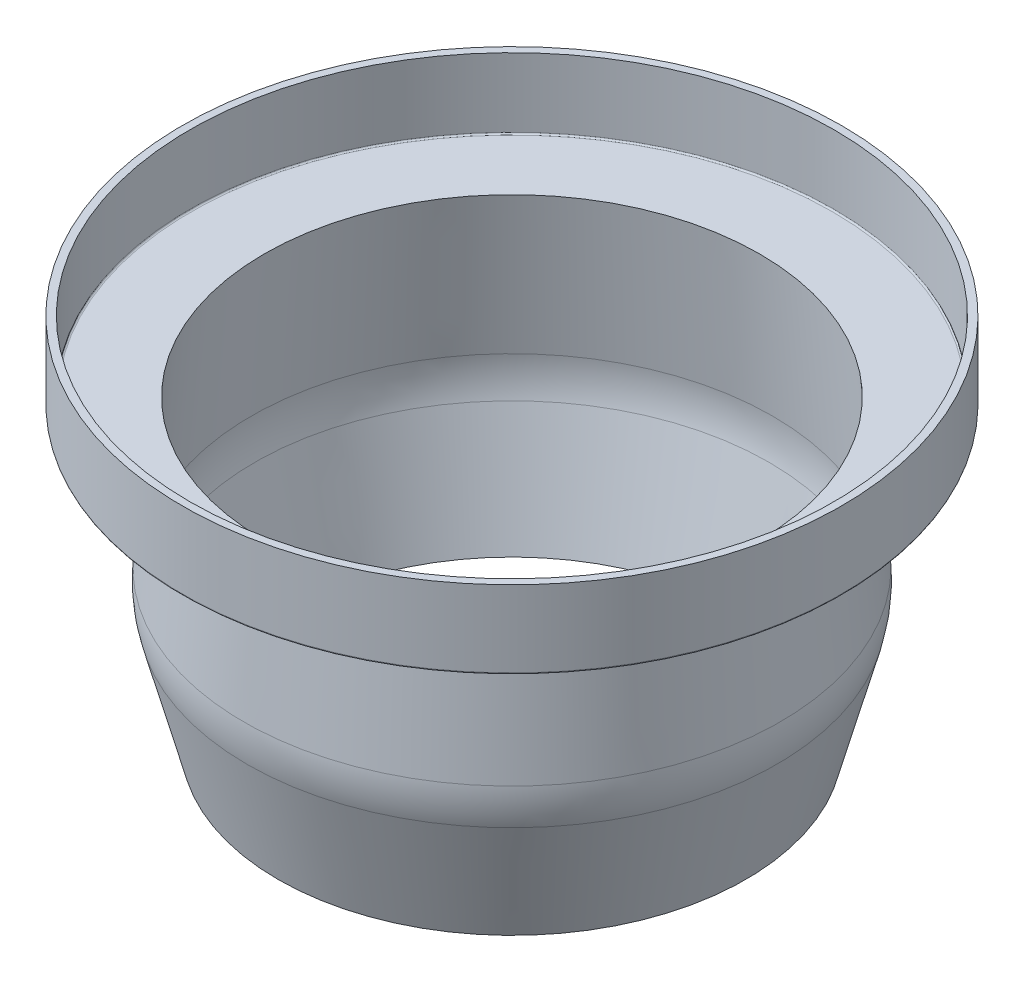
ISO-10303-21;
HEADER;
FILE_DESCRIPTION(('STEP AP214'),'2;1');
FILE_NAME('part.step','',(''),(''),'','','');
FILE_SCHEMA(('AUTOMOTIVE_DESIGN { 1 0 10303 214 1 1 1 1 }'));
ENDSEC;
DATA;
#1=APPLICATION_CONTEXT('core data for automotive mechanical design processes');
#2=APPLICATION_PROTOCOL_DEFINITION('international standard','automotive_design',2000,#1);
#3=PRODUCT_CONTEXT('',#1,'mechanical');
#4=PRODUCT('Part','Part','',(#3));
#5=PRODUCT_RELATED_PRODUCT_CATEGORY('part','',(#4));
#6=PRODUCT_DEFINITION_FORMATION('','',#4);
#7=PRODUCT_DEFINITION_CONTEXT('part definition',#1,'design');
#8=PRODUCT_DEFINITION('design','',#6,#7);
#9=PRODUCT_DEFINITION_SHAPE('','',#8);
#10=(LENGTH_UNIT() NAMED_UNIT(*) SI_UNIT(.MILLI.,.METRE.));
#11=(NAMED_UNIT(*) PLANE_ANGLE_UNIT() SI_UNIT($,.RADIAN.));
#12=(NAMED_UNIT(*) SI_UNIT($,.STERADIAN.) SOLID_ANGLE_UNIT());
#13=UNCERTAINTY_MEASURE_WITH_UNIT(LENGTH_MEASURE(1.E-05),#10,'distance_accuracy_value','');
#14=(GEOMETRIC_REPRESENTATION_CONTEXT(3) GLOBAL_UNCERTAINTY_ASSIGNED_CONTEXT((#13)) GLOBAL_UNIT_ASSIGNED_CONTEXT((#10,
#11,#12)) REPRESENTATION_CONTEXT('',''));
#15=CARTESIAN_POINT('',(0.,0.,0.));
#16=DIRECTION('',(0.,0.,1.));
#17=DIRECTION('',(1.,0.,0.));
#18=AXIS2_PLACEMENT_3D('',#15,#16,#17);
#19=CARTESIAN_POINT('',(0.,0.260642927640769,0.));
#20=DIRECTION('',(0.,-1.,0.));
#21=DIRECTION('',(0.,0.,-1.));
#22=AXIS2_PLACEMENT_3D('',#19,#20,#21);
#23=TOROIDAL_SURFACE('',#22,20.2455301881118,15.);
#24=CARTESIAN_POINT('',(0.,-3.62164274889707,0.));
#25=DIRECTION('',(0.,-1.,0.));
#26=DIRECTION('',(0.,0.,-1.));
#27=AXIS2_PLACEMENT_3D('',#24,#25,#26);
#28=CIRCLE('',#27,34.7344175824478);
#29=CARTESIAN_POINT('',(0.,-3.62164274889707,-34.7344175824478));
#30=VERTEX_POINT('',#29);
#31=EDGE_CURVE('E96',#30,#30,#28,.T.);
#32=ORIENTED_EDGE('',*,*,#31,.T.);
#33=EDGE_LOOP('',(#32));
#34=FACE_BOUND('',#33,.T.);
#35=CARTESIAN_POINT('',(0.,1.56797906885575,0.));
#36=DIRECTION('',(0.,-1.,0.));
#37=DIRECTION('',(0.,0.,-1.));
#38=AXIS2_PLACEMENT_3D('',#35,#36,#37);
#39=CIRCLE('',#38,35.188450659488);
#40=CARTESIAN_POINT('',(0.,1.56797906885575,-35.188450659488));
#41=VERTEX_POINT('',#40);
#42=EDGE_CURVE('E10',#41,#41,#39,.T.);
#43=ORIENTED_EDGE('',*,*,#42,.F.);
#44=EDGE_LOOP('',(#43));
#45=FACE_BOUND('',#44,.T.);
#46=ADVANCED_FACE('F37',(#34,#45),#23,.F.);
#47=CARTESIAN_POINT('',(0.,21.3888888888889,0.));
#48=DIRECTION('',(0.,-1.,0.));
#49=DIRECTION('',(0.,0.,-1.));
#50=AXIS2_PLACEMENT_3D('',#47,#48,#49);
#51=CONICAL_SURFACE('',#50,33.4543457494654,0.0872664625997204);
#52=ORIENTED_EDGE('',*,*,#42,.T.);
#53=EDGE_LOOP('',(#52));
#54=FACE_BOUND('',#53,.T.);
#55=CARTESIAN_POINT('',(0.,21.3888888888889,0.));
#56=DIRECTION('',(0.,-1.,0.));
#57=DIRECTION('',(0.,0.,-1.));
#58=AXIS2_PLACEMENT_3D('',#55,#56,#57);
#59=CIRCLE('',#58,33.4543457494654);
#60=CARTESIAN_POINT('',(0.,21.3888888888889,-33.4543457494654));
#61=VERTEX_POINT('',#60);
#62=EDGE_CURVE('E44',#61,#61,#59,.T.);
#63=ORIENTED_EDGE('',*,*,#62,.F.);
#64=EDGE_LOOP('',(#63));
#65=FACE_BOUND('',#64,.T.);
#66=ADVANCED_FACE('F115',(#54,#65),#51,.F.);
#67=CARTESIAN_POINT('',(0.,21.3888888888889,0.));
#68=DIRECTION('',(0.,1.,0.));
#69=DIRECTION('',(0.,0.,1.));
#70=AXIS2_PLACEMENT_3D('',#67,#68,#69);
#71=PLANE('',#70);
#72=ORIENTED_EDGE('',*,*,#62,.T.);
#73=EDGE_LOOP('',(#72));
#74=FACE_BOUND('',#73,.T.);
#75=CARTESIAN_POINT('',(0.,21.3888888888889,0.));
#76=DIRECTION('',(0.,-1.,0.));
#77=DIRECTION('',(0.,0.,-1.));
#78=AXIS2_PLACEMENT_3D('',#75,#76,#77);
#79=CIRCLE('',#78,43.3);
#80=CARTESIAN_POINT('',(0.,21.3888888888889,-43.3));
#81=VERTEX_POINT('',#80);
#82=EDGE_CURVE('E49',#81,#81,#79,.T.);
#83=ORIENTED_EDGE('',*,*,#82,.F.);
#84=EDGE_LOOP('',(#83));
#85=FACE_BOUND('',#84,.T.);
#86=ADVANCED_FACE('F119',(#74,#85),#71,.T.);
#87=CARTESIAN_POINT('',(0.,21.5888888888889,0.));
#88=DIRECTION('',(0.,-1.,0.));
#89=DIRECTION('',(0.,0.,-1.));
#90=AXIS2_PLACEMENT_3D('',#87,#88,#89);
#91=TOROIDAL_SURFACE('',#90,43.3,0.199999999999999);
#92=ORIENTED_EDGE('',*,*,#82,.T.);
#93=EDGE_LOOP('',(#92));
#94=FACE_BOUND('',#93,.T.);
#95=CARTESIAN_POINT('',(0.,21.5888888888889,0.));
#96=DIRECTION('',(0.,-1.,0.));
#97=DIRECTION('',(0.,0.,-1.));
#98=AXIS2_PLACEMENT_3D('',#95,#96,#97);
#99=CIRCLE('',#98,43.5);
#100=CARTESIAN_POINT('',(0.,21.5888888888889,-43.5));
#101=VERTEX_POINT('',#100);
#102=EDGE_CURVE('E54',#101,#101,#99,.T.);
#103=ORIENTED_EDGE('',*,*,#102,.F.);
#104=EDGE_LOOP('',(#103));
#105=FACE_BOUND('',#104,.T.);
#106=ADVANCED_FACE('F123',(#94,#105),#91,.F.);
#107=CARTESIAN_POINT('',(0.,0.,0.));
#108=DIRECTION('',(0.,-1.,0.));
#109=DIRECTION('',(0.,0.,-1.));
#110=AXIS2_PLACEMENT_3D('',#107,#108,#109);
#111=CYLINDRICAL_SURFACE('',#110,43.5);
#112=ORIENTED_EDGE('',*,*,#102,.T.);
#113=EDGE_LOOP('',(#112));
#114=FACE_BOUND('',#113,.T.);
#115=CARTESIAN_POINT('',(0.,30.8888888888889,0.));
#116=DIRECTION('',(0.,-1.,0.));
#117=DIRECTION('',(0.,0.,-1.));
#118=AXIS2_PLACEMENT_3D('',#115,#116,#117);
#119=CIRCLE('',#118,43.5);
#120=CARTESIAN_POINT('',(0.,30.8888888888889,-43.5));
#121=VERTEX_POINT('',#120);
#122=EDGE_CURVE('E60',#121,#121,#119,.T.);
#123=ORIENTED_EDGE('',*,*,#122,.F.);
#124=EDGE_LOOP('',(#123));
#125=FACE_BOUND('',#124,.T.);
#126=ADVANCED_FACE('F129',(#114,#125),#111,.F.);
#127=CARTESIAN_POINT('',(0.,30.8888888888889,0.));
#128=DIRECTION('',(0.,1.,0.));
#129=DIRECTION('',(0.,0.,1.));
#130=AXIS2_PLACEMENT_3D('',#127,#128,#129);
#131=PLANE('',#130);
#132=ORIENTED_EDGE('',*,*,#122,.T.);
#133=EDGE_LOOP('',(#132));
#134=FACE_BOUND('',#133,.T.);
#135=CARTESIAN_POINT('',(0.,30.8888888888889,0.));
#136=DIRECTION('',(0.,-1.,0.));
#137=DIRECTION('',(0.,0.,-1.));
#138=AXIS2_PLACEMENT_3D('',#135,#136,#137);
#139=CIRCLE('',#138,44.5);
#140=CARTESIAN_POINT('',(0.,30.8888888888889,-44.5));
#141=VERTEX_POINT('',#140);
#142=EDGE_CURVE('E64',#141,#141,#139,.T.);
#143=ORIENTED_EDGE('',*,*,#142,.F.);
#144=EDGE_LOOP('',(#143));
#145=FACE_BOUND('',#144,.T.);
#146=ADVANCED_FACE('F133',(#134,#145),#131,.T.);
#147=CARTESIAN_POINT('',(0.,0.,0.));
#148=DIRECTION('',(0.,-1.,0.));
#149=DIRECTION('',(0.,0.,-1.));
#150=AXIS2_PLACEMENT_3D('',#147,#148,#149);
#151=CYLINDRICAL_SURFACE('',#150,44.5);
#152=CARTESIAN_POINT('',(0.,20.5888888888889,0.));
#153=DIRECTION('',(0.,-1.,0.));
#154=DIRECTION('',(0.,0.,-1.));
#155=AXIS2_PLACEMENT_3D('',#152,#153,#154);
#156=CIRCLE('',#155,44.5);
#157=CARTESIAN_POINT('',(0.,20.5888888888889,-44.5));
#158=VERTEX_POINT('',#157);
#159=EDGE_CURVE('E68',#158,#158,#156,.T.);
#160=ORIENTED_EDGE('',*,*,#159,.F.);
#161=EDGE_LOOP('',(#160));
#162=FACE_BOUND('',#161,.T.);
#163=ORIENTED_EDGE('',*,*,#142,.T.);
#164=EDGE_LOOP('',(#163));
#165=FACE_BOUND('',#164,.T.);
#166=ADVANCED_FACE('F137',(#162,#165),#151,.T.);
#167=CARTESIAN_POINT('',(0.,20.5888888888889,0.));
#168=DIRECTION('',(0.,-1.,0.));
#169=DIRECTION('',(0.,0.,-1.));
#170=AXIS2_PLACEMENT_3D('',#167,#168,#169);
#171=TOROIDAL_SURFACE('',#170,44.3,0.199999999999999);
#172=CARTESIAN_POINT('',(0.,20.3888888888889,0.));
#173=DIRECTION('',(0.,-1.,0.));
#174=DIRECTION('',(0.,0.,-1.));
#175=AXIS2_PLACEMENT_3D('',#172,#173,#174);
#176=CIRCLE('',#175,44.3);
#177=CARTESIAN_POINT('',(0.,20.3888888888889,-44.3));
#178=VERTEX_POINT('',#177);
#179=EDGE_CURVE('E72',#178,#178,#176,.T.);
#180=ORIENTED_EDGE('',*,*,#179,.F.);
#181=EDGE_LOOP('',(#180));
#182=FACE_BOUND('',#181,.T.);
#183=ORIENTED_EDGE('',*,*,#159,.T.);
#184=EDGE_LOOP('',(#183));
#185=FACE_BOUND('',#184,.T.);
#186=ADVANCED_FACE('F141',(#182,#185),#171,.T.);
#187=CARTESIAN_POINT('',(0.,20.3888888888889,0.));
#188=DIRECTION('',(0.,1.,0.));
#189=DIRECTION('',(0.,0.,1.));
#190=AXIS2_PLACEMENT_3D('',#187,#188,#189);
#191=PLANE('',#190);
#192=CARTESIAN_POINT('',(0.,20.3888888888889,0.));
#193=DIRECTION('',(0.,-1.,0.));
#194=DIRECTION('',(0.,0.,-1.));
#195=AXIS2_PLACEMENT_3D('',#192,#193,#194);
#196=CIRCLE('',#195,34.5456542505346);
#197=CARTESIAN_POINT('',(0.,20.3888888888889,-34.5456542505346));
#198=VERTEX_POINT('',#197);
#199=EDGE_CURVE('E76',#198,#198,#196,.T.);
#200=ORIENTED_EDGE('',*,*,#199,.F.);
#201=EDGE_LOOP('',(#200));
#202=FACE_BOUND('',#201,.T.);
#203=ORIENTED_EDGE('',*,*,#179,.T.);
#204=EDGE_LOOP('',(#203));
#205=FACE_BOUND('',#204,.T.);
#206=ADVANCED_FACE('F145',(#202,#205),#191,.F.);
#207=CARTESIAN_POINT('',(0.,20.3888888888889,0.));
#208=DIRECTION('',(0.,-1.,0.));
#209=DIRECTION('',(0.,0.,-1.));
#210=AXIS2_PLACEMENT_3D('',#207,#208,#209);
#211=CONICAL_SURFACE('',#210,34.5456542505346,0.0872664625997208);
#212=CARTESIAN_POINT('',(0.,1.47947880829109,0.));
#213=DIRECTION('',(0.,-1.,0.));
#214=DIRECTION('',(0.,0.,-1.));
#215=AXIS2_PLACEMENT_3D('',#212,#213,#214);
#216=CIRCLE('',#215,36.2000132665498);
#217=CARTESIAN_POINT('',(0.,1.47947880829109,-36.2000132665498));
#218=VERTEX_POINT('',#217);
#219=EDGE_CURVE('E80',#218,#218,#216,.T.);
#220=ORIENTED_EDGE('',*,*,#219,.F.);
#221=EDGE_LOOP('',(#220));
#222=FACE_BOUND('',#221,.T.);
#223=ORIENTED_EDGE('',*,*,#199,.T.);
#224=EDGE_LOOP('',(#223));
#225=FACE_BOUND('',#224,.T.);
#226=ADVANCED_FACE('F149',(#222,#225),#211,.T.);
#227=CARTESIAN_POINT('',(0.,0.172142667076107,0.));
#228=DIRECTION('',(0.,-1.,0.));
#229=DIRECTION('',(0.,0.,-1.));
#230=AXIS2_PLACEMENT_3D('',#227,#228,#229);
#231=TOROIDAL_SURFACE('',#230,21.2570927951737,15.);
#232=CARTESIAN_POINT('',(0.,-3.71014300946172,0.));
#233=DIRECTION('',(0.,-1.,0.));
#234=DIRECTION('',(0.,0.,-1.));
#235=AXIS2_PLACEMENT_3D('',#232,#233,#234);
#236=CIRCLE('',#235,35.7459801895097);
#237=CARTESIAN_POINT('',(0.,-3.71014300946172,-35.7459801895097));
#238=VERTEX_POINT('',#237);
#239=EDGE_CURVE('E84',#238,#238,#236,.T.);
#240=ORIENTED_EDGE('',*,*,#239,.F.);
#241=EDGE_LOOP('',(#240));
#242=FACE_BOUND('',#241,.T.);
#243=ORIENTED_EDGE('',*,*,#219,.T.);
#244=EDGE_LOOP('',(#243));
#245=FACE_BOUND('',#244,.T.);
#246=ADVANCED_FACE('F153',(#242,#245),#231,.T.);
#247=CARTESIAN_POINT('',(0.,-3.71014300946172,0.));
#248=DIRECTION('',(0.,1.,0.));
#249=DIRECTION('',(0.,0.,1.));
#250=AXIS2_PLACEMENT_3D('',#247,#248,#249);
#251=CONICAL_SURFACE('',#250,35.7459801895097,0.261799387799147);
#252=CARTESIAN_POINT('',(0.,-19.2405206336624,0.));
#253=DIRECTION('',(0.,-1.,0.));
#254=DIRECTION('',(0.,0.,-1.));
#255=AXIS2_PLACEMENT_3D('',#252,#253,#254);
#256=CIRCLE('',#255,31.5846280469548);
#257=CARTESIAN_POINT('',(0.,-19.2405206336624,-31.5846280469548));
#258=VERTEX_POINT('',#257);
#259=EDGE_CURVE('E88',#258,#258,#256,.T.);
#260=ORIENTED_EDGE('',*,*,#259,.F.);
#261=EDGE_LOOP('',(#260));
#262=FACE_BOUND('',#261,.T.);
#263=ORIENTED_EDGE('',*,*,#239,.T.);
#264=EDGE_LOOP('',(#263));
#265=FACE_BOUND('',#264,.T.);
#266=ADVANCED_FACE('F111',(#262,#265),#251,.T.);
#267=CARTESIAN_POINT('',(0.,-19.2405206336624,0.));
#268=DIRECTION('',(0.,-1.,0.));
#269=DIRECTION('',(0.,0.,-1.));
#270=AXIS2_PLACEMENT_3D('',#267,#268,#269);
#271=CONICAL_SURFACE('',#270,31.5846280469548,1.30899693899575);
#272=CARTESIAN_POINT('',(0.,-18.9817015885599,0.));
#273=DIRECTION('',(0.,-1.,0.));
#274=DIRECTION('',(0.,0.,-1.));
#275=AXIS2_PLACEMENT_3D('',#272,#273,#274);
#276=CIRCLE('',#275,30.6187022206657);
#277=CARTESIAN_POINT('',(0.,-18.9817015885599,-30.6187022206657));
#278=VERTEX_POINT('',#277);
#279=EDGE_CURVE('E92',#278,#278,#276,.T.);
#280=ORIENTED_EDGE('',*,*,#279,.F.);
#281=EDGE_LOOP('',(#280));
#282=FACE_BOUND('',#281,.T.);
#283=ORIENTED_EDGE('',*,*,#259,.T.);
#284=EDGE_LOOP('',(#283));
#285=FACE_BOUND('',#284,.T.);
#286=ADVANCED_FACE('F105',(#282,#285),#271,.F.);
#287=CARTESIAN_POINT('',(0.,-3.62164274889707,0.));
#288=DIRECTION('',(0.,1.,0.));
#289=DIRECTION('',(0.,0.,1.));
#290=AXIS2_PLACEMENT_3D('',#287,#288,#289);
#291=CONICAL_SURFACE('',#290,34.7344175824478,0.261799387799147);
#292=ORIENTED_EDGE('',*,*,#279,.T.);
#293=EDGE_LOOP('',(#292));
#294=FACE_BOUND('',#293,.T.);
#295=ORIENTED_EDGE('',*,*,#31,.F.);
#296=EDGE_LOOP('',(#295));
#297=FACE_BOUND('',#296,.T.);
#298=ADVANCED_FACE('F103',(#294,#297),#291,.F.);
#299=CLOSED_SHELL('',(#46,#66,#86,#106,#126,#146,#166,#186,#206,#226,#246,#266,#286,#298));
#300=MANIFOLD_SOLID_BREP('B2',#299);
#301=ADVANCED_BREP_SHAPE_REPRESENTATION('',(#18,#300),#14);
#302=SHAPE_DEFINITION_REPRESENTATION(#9,#301);
ENDSEC;
END-ISO-10303-21;
